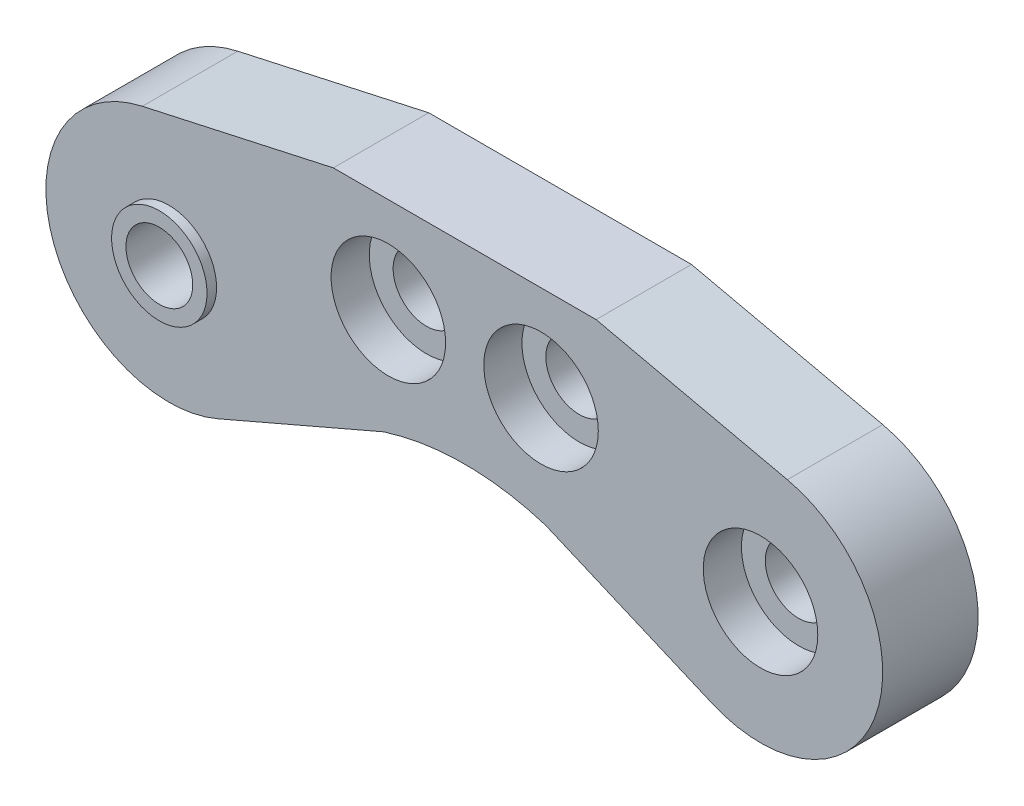
ISO-10303-21;
HEADER;
FILE_DESCRIPTION(('STEP AP214'),'2;1');
FILE_NAME('part.step','',(''),(''),'','','');
FILE_SCHEMA(('AUTOMOTIVE_DESIGN { 1 0 10303 214 1 1 1 1 }'));
ENDSEC;
DATA;
#1=APPLICATION_CONTEXT('core data for automotive mechanical design processes');
#2=APPLICATION_PROTOCOL_DEFINITION('international standard','automotive_design',2000,#1);
#3=PRODUCT_CONTEXT('',#1,'mechanical');
#4=PRODUCT('Part','Part','',(#3));
#5=PRODUCT_RELATED_PRODUCT_CATEGORY('part','',(#4));
#6=PRODUCT_DEFINITION_FORMATION('','',#4);
#7=PRODUCT_DEFINITION_CONTEXT('part definition',#1,'design');
#8=PRODUCT_DEFINITION('design','',#6,#7);
#9=PRODUCT_DEFINITION_SHAPE('','',#8);
#10=(LENGTH_UNIT() NAMED_UNIT(*) SI_UNIT(.MILLI.,.METRE.));
#11=(NAMED_UNIT(*) PLANE_ANGLE_UNIT() SI_UNIT($,.RADIAN.));
#12=(NAMED_UNIT(*) SI_UNIT($,.STERADIAN.) SOLID_ANGLE_UNIT());
#13=UNCERTAINTY_MEASURE_WITH_UNIT(LENGTH_MEASURE(1.E-05),#10,'distance_accuracy_value','');
#14=(GEOMETRIC_REPRESENTATION_CONTEXT(3) GLOBAL_UNCERTAINTY_ASSIGNED_CONTEXT((#13)) GLOBAL_UNIT_ASSIGNED_CONTEXT((#10,
#11,#12)) REPRESENTATION_CONTEXT('',''));
#15=CARTESIAN_POINT('',(0.,0.,0.));
#16=DIRECTION('',(0.,0.,1.));
#17=DIRECTION('',(1.,0.,0.));
#18=AXIS2_PLACEMENT_3D('',#15,#16,#17);
#19=CARTESIAN_POINT('',(45.5,-0.500000000000042,0.));
#20=DIRECTION('',(0.,0.,1.));
#21=DIRECTION('',(1.,0.,0.));
#22=AXIS2_PLACEMENT_3D('',#19,#20,#21);
#23=CYLINDRICAL_SURFACE('',#22,1.75);
#24=CARTESIAN_POINT('',(45.5,-0.500000000000042,0.));
#25=DIRECTION('',(0.,0.,1.));
#26=DIRECTION('',(1.,0.,0.));
#27=AXIS2_PLACEMENT_3D('',#24,#25,#26);
#28=CIRCLE('',#27,1.75);
#29=CARTESIAN_POINT('',(47.25,-0.500000000000042,0.));
#30=VERTEX_POINT('',#29);
#31=EDGE_CURVE('E187',#30,#30,#28,.T.);
#32=ORIENTED_EDGE('',*,*,#31,.F.);
#33=EDGE_LOOP('',(#32));
#34=FACE_BOUND('',#33,.T.);
#35=CARTESIAN_POINT('',(45.5,-0.500000000000042,3.));
#36=DIRECTION('',(0.,0.,1.));
#37=DIRECTION('',(1.,0.,0.));
#38=AXIS2_PLACEMENT_3D('',#35,#36,#37);
#39=CIRCLE('',#38,1.75);
#40=CARTESIAN_POINT('',(47.25,-0.500000000000042,3.));
#41=VERTEX_POINT('',#40);
#42=EDGE_CURVE('E36',#41,#41,#39,.F.);
#43=ORIENTED_EDGE('',*,*,#42,.F.);
#44=EDGE_LOOP('',(#43));
#45=FACE_BOUND('',#44,.T.);
#46=ADVANCED_FACE('F32',(#34,#45),#23,.F.);
#47=CARTESIAN_POINT('',(26.,3.00000000000002,0.));
#48=DIRECTION('',(0.,0.,1.));
#49=DIRECTION('',(1.,0.,0.));
#50=AXIS2_PLACEMENT_3D('',#47,#48,#49);
#51=CYLINDRICAL_SURFACE('',#50,1.75);
#52=CARTESIAN_POINT('',(26.,3.00000000000002,0.));
#53=DIRECTION('',(0.,0.,1.));
#54=DIRECTION('',(1.,0.,0.));
#55=AXIS2_PLACEMENT_3D('',#52,#53,#54);
#56=CIRCLE('',#55,1.75);
#57=CARTESIAN_POINT('',(27.75,3.00000000000002,0.));
#58=VERTEX_POINT('',#57);
#59=EDGE_CURVE('E190',#58,#58,#56,.T.);
#60=ORIENTED_EDGE('',*,*,#59,.F.);
#61=EDGE_LOOP('',(#60));
#62=FACE_BOUND('',#61,.T.);
#63=CARTESIAN_POINT('',(26.,3.00000000000002,3.));
#64=DIRECTION('',(0.,0.,1.));
#65=DIRECTION('',(1.,0.,0.));
#66=AXIS2_PLACEMENT_3D('',#63,#64,#65);
#67=CIRCLE('',#66,1.75);
#68=CARTESIAN_POINT('',(27.75,3.00000000000002,3.));
#69=VERTEX_POINT('',#68);
#70=EDGE_CURVE('E161',#69,#69,#67,.F.);
#71=ORIENTED_EDGE('',*,*,#70,.F.);
#72=EDGE_LOOP('',(#71));
#73=FACE_BOUND('',#72,.T.);
#74=ADVANCED_FACE('F229',(#62,#73),#51,.F.);
#75=CARTESIAN_POINT('',(34.,3.00000000000002,0.));
#76=DIRECTION('',(0.,0.,1.));
#77=DIRECTION('',(1.,0.,0.));
#78=AXIS2_PLACEMENT_3D('',#75,#76,#77);
#79=CYLINDRICAL_SURFACE('',#78,1.75);
#80=CARTESIAN_POINT('',(34.,3.00000000000002,0.));
#81=DIRECTION('',(0.,0.,1.));
#82=DIRECTION('',(1.,0.,0.));
#83=AXIS2_PLACEMENT_3D('',#80,#81,#82);
#84=CIRCLE('',#83,1.75);
#85=CARTESIAN_POINT('',(35.75,3.00000000000002,0.));
#86=VERTEX_POINT('',#85);
#87=EDGE_CURVE('E183',#86,#86,#84,.T.);
#88=ORIENTED_EDGE('',*,*,#87,.F.);
#89=EDGE_LOOP('',(#88));
#90=FACE_BOUND('',#89,.T.);
#91=CARTESIAN_POINT('',(34.,3.00000000000002,3.));
#92=DIRECTION('',(0.,0.,1.));
#93=DIRECTION('',(1.,0.,0.));
#94=AXIS2_PLACEMENT_3D('',#91,#92,#93);
#95=CIRCLE('',#94,1.75);
#96=CARTESIAN_POINT('',(35.75,3.00000000000002,3.));
#97=VERTEX_POINT('',#96);
#98=EDGE_CURVE('E159',#97,#97,#95,.F.);
#99=ORIENTED_EDGE('',*,*,#98,.F.);
#100=EDGE_LOOP('',(#99));
#101=FACE_BOUND('',#100,.T.);
#102=ADVANCED_FACE('F235',(#90,#101),#79,.F.);
#103=CARTESIAN_POINT('',(45.5,-0.500000000000042,5.));
#104=DIRECTION('',(0.,0.,1.));
#105=DIRECTION('',(1.,0.,0.));
#106=AXIS2_PLACEMENT_3D('',#103,#104,#105);
#107=PLANE('',#106);
#108=CARTESIAN_POINT('',(26.,3.00000000000002,5.));
#109=DIRECTION('',(0.,0.,1.));
#110=DIRECTION('',(1.,0.,0.));
#111=AXIS2_PLACEMENT_3D('',#108,#109,#110);
#112=CIRCLE('',#111,3.);
#113=CARTESIAN_POINT('',(29.,3.00000000000002,5.));
#114=VERTEX_POINT('',#113);
#115=EDGE_CURVE('E254',#114,#114,#112,.T.);
#116=ORIENTED_EDGE('',*,*,#115,.F.);
#117=EDGE_LOOP('',(#116));
#118=FACE_BOUND('',#117,.T.);
#119=CARTESIAN_POINT('',(34.,3.00000000000002,5.));
#120=DIRECTION('',(0.,0.,1.));
#121=DIRECTION('',(1.,0.,0.));
#122=AXIS2_PLACEMENT_3D('',#119,#120,#121);
#123=CIRCLE('',#122,3.);
#124=CARTESIAN_POINT('',(37.,3.00000000000002,5.));
#125=VERTEX_POINT('',#124);
#126=EDGE_CURVE('E258',#125,#125,#123,.T.);
#127=ORIENTED_EDGE('',*,*,#126,.F.);
#128=EDGE_LOOP('',(#127));
#129=FACE_BOUND('',#128,.T.);
#130=CARTESIAN_POINT('',(45.5,-0.500000000000042,5.));
#131=DIRECTION('',(0.,0.,1.));
#132=DIRECTION('',(1.,0.,0.));
#133=AXIS2_PLACEMENT_3D('',#130,#131,#132);
#134=CIRCLE('',#133,3.);
#135=CARTESIAN_POINT('',(48.5,-0.500000000000042,5.));
#136=VERTEX_POINT('',#135);
#137=EDGE_CURVE('E180',#136,#136,#134,.T.);
#138=ORIENTED_EDGE('',*,*,#137,.F.);
#139=EDGE_LOOP('',(#138));
#140=FACE_BOUND('',#139,.T.);
#141=DIRECTION('',(-0.97650782216454,-0.215481955744482,0.));
#142=VECTOR('',#141,1.);
#143=CARTESIAN_POINT('',(13.1115329469218,5.79216926059621,5.));
#144=LINE('',#143,#142);
#145=CARTESIAN_POINT('',(23.116843969807,8.,5.));
#146=VERTEX_POINT('',#145);
#147=CARTESIAN_POINT('',(13.1115329469218,5.79216926059621,5.));
#148=VERTEX_POINT('',#147);
#149=EDGE_CURVE('E147',#146,#148,#144,.T.);
#150=ORIENTED_EDGE('',*,*,#149,.T.);
#151=CARTESIAN_POINT('',(14.5,-0.49999999999998,5.));
#152=DIRECTION('',(0.,0.,1.));
#153=DIRECTION('',(1.,0.,0.));
#154=AXIS2_PLACEMENT_3D('',#151,#152,#153);
#155=CIRCLE('',#154,6.44354209743951);
#156=CARTESIAN_POINT('',(17.054090449502,-6.41572960312063,5.));
#157=VERTEX_POINT('',#156);
#158=EDGE_CURVE('E94',#148,#157,#155,.T.);
#159=ORIENTED_EDGE('',*,*,#158,.T.);
#160=DIRECTION('',(0.918086591763155,0.396379880953503,0.));
#161=VECTOR('',#160,1.);
#162=CARTESIAN_POINT('',(25.7555585383118,-2.65890871486508,5.));
#163=LINE('',#162,#161);
#164=CARTESIAN_POINT('',(25.7555585383118,-2.65890871486508,5.));
#165=VERTEX_POINT('',#164);
#166=EDGE_CURVE('E197',#157,#165,#163,.T.);
#167=ORIENTED_EDGE('',*,*,#166,.T.);
#168=CARTESIAN_POINT('',(30.,-15.9999999999997,5.));
#169=DIRECTION('',(0.,0.,-1.));
#170=DIRECTION('',(1.,0.,0.));
#171=AXIS2_PLACEMENT_3D('',#168,#169,#170);
#172=CIRCLE('',#171,13.9999999999998);
#173=CARTESIAN_POINT('',(34.2444414616882,-2.65890871486509,5.));
#174=VERTEX_POINT('',#173);
#175=EDGE_CURVE('E199',#165,#174,#172,.T.);
#176=ORIENTED_EDGE('',*,*,#175,.T.);
#177=DIRECTION('',(0.91985405001222,-0.392260789113719,0.));
#178=VECTOR('',#177,1.);
#179=CARTESIAN_POINT('',(34.2444414616882,-2.65890871486509,5.));
#180=LINE('',#179,#178);
#181=CARTESIAN_POINT('',(42.9891405720765,-6.38798135802775,5.));
#182=VERTEX_POINT('',#181);
#183=EDGE_CURVE('E114',#174,#182,#180,.T.);
#184=ORIENTED_EDGE('',*,*,#183,.T.);
#185=CARTESIAN_POINT('',(45.5,-0.500000000000042,5.));
#186=DIRECTION('',(0.,0.,1.));
#187=DIRECTION('',(1.,0.,0.));
#188=AXIS2_PLACEMENT_3D('',#185,#186,#187);
#189=CIRCLE('',#188,6.40099519912913);
#190=CARTESIAN_POINT('',(46.9052092102304,5.744848005737,5.));
#191=VERTEX_POINT('',#190);
#192=EDGE_CURVE('E107',#182,#191,#189,.T.);
#193=ORIENTED_EDGE('',*,*,#192,.T.);
#194=DIRECTION('',(-0.975605794328148,0.21952980224412,0.));
#195=VECTOR('',#194,1.);
#196=CARTESIAN_POINT('',(46.9052092102304,5.744848005737,5.));
#197=LINE('',#196,#195);
#198=CARTESIAN_POINT('',(36.883156030193,8.,5.));
#199=VERTEX_POINT('',#198);
#200=EDGE_CURVE('E112',#191,#199,#197,.T.);
#201=ORIENTED_EDGE('',*,*,#200,.T.);
#202=DIRECTION('',(-1.,0.,0.));
#203=VECTOR('',#202,1.);
#204=CARTESIAN_POINT('',(23.116843969807,8.,5.));
#205=LINE('',#204,#203);
#206=EDGE_CURVE('E51',#199,#146,#205,.T.);
#207=ORIENTED_EDGE('',*,*,#206,.T.);
#208=EDGE_LOOP('',(#150,#159,#167,#176,#184,#193,#201,#207));
#209=FACE_BOUND('',#208,.T.);
#210=CARTESIAN_POINT('',(14.5,-0.49999999999998,5.));
#211=DIRECTION('',(0.,0.,1.));
#212=DIRECTION('',(1.,0.,0.));
#213=AXIS2_PLACEMENT_3D('',#210,#211,#212);
#214=CIRCLE('',#213,2.5);
#215=CARTESIAN_POINT('',(17.,-0.49999999999998,5.));
#216=VERTEX_POINT('',#215);
#217=EDGE_CURVE('E171',#216,#216,#214,.T.);
#218=ORIENTED_EDGE('',*,*,#217,.F.);
#219=EDGE_LOOP('',(#218));
#220=FACE_BOUND('',#219,.T.);
#221=ADVANCED_FACE('F109',(#118,#129,#140,#209,#220),#107,.T.);
#222=CARTESIAN_POINT('',(13.1115329469218,5.79216926059621,5.));
#223=DIRECTION('',(0.215481955744482,-0.97650782216454,0.));
#224=DIRECTION('',(0.97650782216454,0.215481955744482,0.));
#225=AXIS2_PLACEMENT_3D('',#222,#223,#224);
#226=PLANE('',#225);
#227=DIRECTION('',(-0.97650782216454,-0.215481955744482,0.));
#228=VECTOR('',#227,1.);
#229=CARTESIAN_POINT('',(13.1115329469218,5.79216926059621,0.));
#230=LINE('',#229,#228);
#231=CARTESIAN_POINT('',(23.116843969807,8.,0.));
#232=VERTEX_POINT('',#231);
#233=CARTESIAN_POINT('',(13.1115329469218,5.79216926059621,0.));
#234=VERTEX_POINT('',#233);
#235=EDGE_CURVE('E132',#232,#234,#230,.T.);
#236=ORIENTED_EDGE('',*,*,#235,.T.);
#237=DIRECTION('',(0.,0.,-1.));
#238=VECTOR('',#237,1.);
#239=CARTESIAN_POINT('',(13.1115329469218,5.79216926059621,5.));
#240=LINE('',#239,#238);
#241=EDGE_CURVE('E11',#148,#234,#240,.T.);
#242=ORIENTED_EDGE('',*,*,#241,.F.);
#243=ORIENTED_EDGE('',*,*,#149,.F.);
#244=DIRECTION('',(0.,0.,-1.));
#245=VECTOR('',#244,1.);
#246=CARTESIAN_POINT('',(23.116843969807,8.,5.));
#247=LINE('',#246,#245);
#248=EDGE_CURVE('E128',#146,#232,#247,.T.);
#249=ORIENTED_EDGE('',*,*,#248,.T.);
#250=EDGE_LOOP('',(#236,#242,#243,#249));
#251=FACE_BOUND('',#250,.T.);
#252=ADVANCED_FACE('F34',(#251),#226,.F.);
#253=CARTESIAN_POINT('',(14.5,-0.49999999999998,5.));
#254=DIRECTION('',(0.,0.,-1.));
#255=DIRECTION('',(-1.,0.,0.));
#256=AXIS2_PLACEMENT_3D('',#253,#254,#255);
#257=CYLINDRICAL_SURFACE('',#256,6.44354209743951);
#258=CARTESIAN_POINT('',(14.5,-0.49999999999998,0.));
#259=DIRECTION('',(0.,0.,1.));
#260=DIRECTION('',(1.,0.,0.));
#261=AXIS2_PLACEMENT_3D('',#258,#259,#260);
#262=CIRCLE('',#261,6.44354209743951);
#263=CARTESIAN_POINT('',(17.054090449502,-6.41572960312063,0.));
#264=VERTEX_POINT('',#263);
#265=EDGE_CURVE('E135',#234,#264,#262,.T.);
#266=ORIENTED_EDGE('',*,*,#265,.T.);
#267=DIRECTION('',(0.,0.,-1.));
#268=VECTOR('',#267,1.);
#269=CARTESIAN_POINT('',(17.054090449502,-6.41572960312063,5.));
#270=LINE('',#269,#268);
#271=EDGE_CURVE('E42',#157,#264,#270,.T.);
#272=ORIENTED_EDGE('',*,*,#271,.F.);
#273=ORIENTED_EDGE('',*,*,#158,.F.);
#274=ORIENTED_EDGE('',*,*,#241,.T.);
#275=EDGE_LOOP('',(#266,#272,#273,#274));
#276=FACE_BOUND('',#275,.T.);
#277=ADVANCED_FACE('F249',(#276),#257,.T.);
#278=CARTESIAN_POINT('',(25.7555585383118,-2.65890871486508,5.));
#279=DIRECTION('',(-0.396379880953503,0.918086591763155,0.));
#280=DIRECTION('',(-0.918086591763155,-0.396379880953503,0.));
#281=AXIS2_PLACEMENT_3D('',#278,#279,#280);
#282=PLANE('',#281);
#283=DIRECTION('',(0.918086591763155,0.396379880953503,0.));
#284=VECTOR('',#283,1.);
#285=CARTESIAN_POINT('',(25.7555585383118,-2.65890871486508,0.));
#286=LINE('',#285,#284);
#287=CARTESIAN_POINT('',(25.7555585383118,-2.65890871486508,0.));
#288=VERTEX_POINT('',#287);
#289=EDGE_CURVE('E138',#264,#288,#286,.T.);
#290=ORIENTED_EDGE('',*,*,#289,.T.);
#291=DIRECTION('',(0.,0.,-1.));
#292=VECTOR('',#291,1.);
#293=CARTESIAN_POINT('',(25.7555585383118,-2.65890871486508,5.));
#294=LINE('',#293,#292);
#295=EDGE_CURVE('E154',#165,#288,#294,.T.);
#296=ORIENTED_EDGE('',*,*,#295,.F.);
#297=ORIENTED_EDGE('',*,*,#166,.F.);
#298=ORIENTED_EDGE('',*,*,#271,.T.);
#299=EDGE_LOOP('',(#290,#296,#297,#298));
#300=FACE_BOUND('',#299,.T.);
#301=ADVANCED_FACE('F428',(#300),#282,.F.);
#302=CARTESIAN_POINT('',(30.,-15.9999999999997,5.));
#303=DIRECTION('',(0.,0.,-1.));
#304=DIRECTION('',(-1.,0.,0.));
#305=AXIS2_PLACEMENT_3D('',#302,#303,#304);
#306=CYLINDRICAL_SURFACE('',#305,13.9999999999998);
#307=CARTESIAN_POINT('',(30.,-15.9999999999997,0.));
#308=DIRECTION('',(0.,0.,-1.));
#309=DIRECTION('',(1.,0.,0.));
#310=AXIS2_PLACEMENT_3D('',#307,#308,#309);
#311=CIRCLE('',#310,13.9999999999998);
#312=CARTESIAN_POINT('',(34.2444414616882,-2.65890871486509,0.));
#313=VERTEX_POINT('',#312);
#314=EDGE_CURVE('E140',#288,#313,#311,.T.);
#315=ORIENTED_EDGE('',*,*,#314,.T.);
#316=DIRECTION('',(0.,0.,-1.));
#317=VECTOR('',#316,1.);
#318=CARTESIAN_POINT('',(34.2444414616882,-2.65890871486509,5.));
#319=LINE('',#318,#317);
#320=EDGE_CURVE('E151',#174,#313,#319,.T.);
#321=ORIENTED_EDGE('',*,*,#320,.F.);
#322=ORIENTED_EDGE('',*,*,#175,.F.);
#323=ORIENTED_EDGE('',*,*,#295,.T.);
#324=EDGE_LOOP('',(#315,#321,#322,#323));
#325=FACE_BOUND('',#324,.T.);
#326=ADVANCED_FACE('F205',(#325),#306,.F.);
#327=CARTESIAN_POINT('',(34.2444414616882,-2.65890871486509,5.));
#328=DIRECTION('',(0.392260789113719,0.91985405001222,0.));
#329=DIRECTION('',(-0.91985405001222,0.392260789113719,0.));
#330=AXIS2_PLACEMENT_3D('',#327,#328,#329);
#331=PLANE('',#330);
#332=DIRECTION('',(0.91985405001222,-0.392260789113719,0.));
#333=VECTOR('',#332,1.);
#334=CARTESIAN_POINT('',(34.2444414616882,-2.65890871486509,0.));
#335=LINE('',#334,#333);
#336=CARTESIAN_POINT('',(42.9891405720765,-6.38798135802775,0.));
#337=VERTEX_POINT('',#336);
#338=EDGE_CURVE('E142',#313,#337,#335,.T.);
#339=ORIENTED_EDGE('',*,*,#338,.T.);
#340=DIRECTION('',(0.,0.,-1.));
#341=VECTOR('',#340,1.);
#342=CARTESIAN_POINT('',(42.9891405720765,-6.38798135802775,5.));
#343=LINE('',#342,#341);
#344=EDGE_CURVE('E123',#182,#337,#343,.T.);
#345=ORIENTED_EDGE('',*,*,#344,.F.);
#346=ORIENTED_EDGE('',*,*,#183,.F.);
#347=ORIENTED_EDGE('',*,*,#320,.T.);
#348=EDGE_LOOP('',(#339,#345,#346,#347));
#349=FACE_BOUND('',#348,.T.);
#350=ADVANCED_FACE('F209',(#349),#331,.F.);
#351=CARTESIAN_POINT('',(45.5,-0.500000000000042,5.));
#352=DIRECTION('',(0.,0.,-1.));
#353=DIRECTION('',(-1.,0.,0.));
#354=AXIS2_PLACEMENT_3D('',#351,#352,#353);
#355=CYLINDRICAL_SURFACE('',#354,6.40099519912913);
#356=CARTESIAN_POINT('',(45.5,-0.500000000000042,0.));
#357=DIRECTION('',(0.,0.,1.));
#358=DIRECTION('',(1.,0.,0.));
#359=AXIS2_PLACEMENT_3D('',#356,#357,#358);
#360=CIRCLE('',#359,6.40099519912913);
#361=CARTESIAN_POINT('',(46.9052092102304,5.744848005737,0.));
#362=VERTEX_POINT('',#361);
#363=EDGE_CURVE('E122',#337,#362,#360,.T.);
#364=ORIENTED_EDGE('',*,*,#363,.T.);
#365=DIRECTION('',(0.,0.,-1.));
#366=VECTOR('',#365,1.);
#367=CARTESIAN_POINT('',(46.9052092102304,5.744848005737,5.));
#368=LINE('',#367,#366);
#369=EDGE_CURVE('E119',#191,#362,#368,.T.);
#370=ORIENTED_EDGE('',*,*,#369,.F.);
#371=ORIENTED_EDGE('',*,*,#192,.F.);
#372=ORIENTED_EDGE('',*,*,#344,.T.);
#373=EDGE_LOOP('',(#364,#370,#371,#372));
#374=FACE_BOUND('',#373,.T.);
#375=ADVANCED_FACE('F120',(#374),#355,.T.);
#376=CARTESIAN_POINT('',(46.9052092102304,5.744848005737,5.));
#377=DIRECTION('',(-0.21952980224412,-0.975605794328149,0.));
#378=DIRECTION('',(0.975605794328149,-0.21952980224412,0.));
#379=AXIS2_PLACEMENT_3D('',#376,#377,#378);
#380=PLANE('',#379);
#381=DIRECTION('',(-0.975605794328148,0.21952980224412,0.));
#382=VECTOR('',#381,1.);
#383=CARTESIAN_POINT('',(46.9052092102304,5.744848005737,0.));
#384=LINE('',#383,#382);
#385=CARTESIAN_POINT('',(36.883156030193,8.,0.));
#386=VERTEX_POINT('',#385);
#387=EDGE_CURVE('E80',#362,#386,#384,.T.);
#388=ORIENTED_EDGE('',*,*,#387,.T.);
#389=DIRECTION('',(0.,0.,-1.));
#390=VECTOR('',#389,1.);
#391=CARTESIAN_POINT('',(36.883156030193,8.,5.));
#392=LINE('',#391,#390);
#393=EDGE_CURVE('E124',#199,#386,#392,.T.);
#394=ORIENTED_EDGE('',*,*,#393,.F.);
#395=ORIENTED_EDGE('',*,*,#200,.F.);
#396=ORIENTED_EDGE('',*,*,#369,.T.);
#397=EDGE_LOOP('',(#388,#394,#395,#396));
#398=FACE_BOUND('',#397,.T.);
#399=ADVANCED_FACE('F126',(#398),#380,.F.);
#400=CARTESIAN_POINT('',(23.116843969807,8.,5.));
#401=DIRECTION('',(0.,-1.,0.));
#402=DIRECTION('',(1.,0.,0.));
#403=AXIS2_PLACEMENT_3D('',#400,#401,#402);
#404=PLANE('',#403);
#405=DIRECTION('',(-1.,0.,0.));
#406=VECTOR('',#405,1.);
#407=CARTESIAN_POINT('',(23.116843969807,8.,0.));
#408=LINE('',#407,#406);
#409=EDGE_CURVE('E86',#386,#232,#408,.T.);
#410=ORIENTED_EDGE('',*,*,#409,.T.);
#411=ORIENTED_EDGE('',*,*,#248,.F.);
#412=ORIENTED_EDGE('',*,*,#206,.F.);
#413=ORIENTED_EDGE('',*,*,#393,.T.);
#414=EDGE_LOOP('',(#410,#411,#412,#413));
#415=FACE_BOUND('',#414,.T.);
#416=ADVANCED_FACE('F217',(#415),#404,.F.);
#417=CARTESIAN_POINT('',(45.5,-0.500000000000042,0.));
#418=DIRECTION('',(0.,0.,1.));
#419=DIRECTION('',(1.,0.,0.));
#420=AXIS2_PLACEMENT_3D('',#417,#418,#419);
#421=PLANE('',#420);
#422=CARTESIAN_POINT('',(14.5,-0.49999999999998,0.));
#423=DIRECTION('',(0.,0.,1.));
#424=DIRECTION('',(1.,0.,0.));
#425=AXIS2_PLACEMENT_3D('',#422,#423,#424);
#426=CIRCLE('',#425,1.75);
#427=CARTESIAN_POINT('',(16.25,-0.49999999999998,0.));
#428=VERTEX_POINT('',#427);
#429=EDGE_CURVE('E136',#428,#428,#426,.T.);
#430=ORIENTED_EDGE('',*,*,#429,.T.);
#431=EDGE_LOOP('',(#430));
#432=FACE_BOUND('',#431,.T.);
#433=ORIENTED_EDGE('',*,*,#87,.T.);
#434=EDGE_LOOP('',(#433));
#435=FACE_BOUND('',#434,.T.);
#436=ORIENTED_EDGE('',*,*,#59,.T.);
#437=EDGE_LOOP('',(#436));
#438=FACE_BOUND('',#437,.T.);
#439=ORIENTED_EDGE('',*,*,#31,.T.);
#440=EDGE_LOOP('',(#439));
#441=FACE_BOUND('',#440,.T.);
#442=ORIENTED_EDGE('',*,*,#235,.F.);
#443=ORIENTED_EDGE('',*,*,#409,.F.);
#444=ORIENTED_EDGE('',*,*,#387,.F.);
#445=ORIENTED_EDGE('',*,*,#363,.F.);
#446=ORIENTED_EDGE('',*,*,#338,.F.);
#447=ORIENTED_EDGE('',*,*,#314,.F.);
#448=ORIENTED_EDGE('',*,*,#289,.F.);
#449=ORIENTED_EDGE('',*,*,#265,.F.);
#450=EDGE_LOOP('',(#442,#443,#444,#445,#446,#447,#448,#449));
#451=FACE_BOUND('',#450,.T.);
#452=ADVANCED_FACE('F212',(#432,#435,#438,#441,#451),#421,.F.);
#453=CARTESIAN_POINT('',(14.5,-0.49999999999998,0.));
#454=DIRECTION('',(0.,0.,1.));
#455=DIRECTION('',(1.,0.,0.));
#456=AXIS2_PLACEMENT_3D('',#453,#454,#455);
#457=CYLINDRICAL_SURFACE('',#456,1.75);
#458=ORIENTED_EDGE('',*,*,#429,.F.);
#459=EDGE_LOOP('',(#458));
#460=FACE_BOUND('',#459,.T.);
#461=CARTESIAN_POINT('',(14.5,-0.49999999999998,5.5));
#462=DIRECTION('',(0.,0.,1.));
#463=DIRECTION('',(1.,0.,0.));
#464=AXIS2_PLACEMENT_3D('',#461,#462,#463);
#465=CIRCLE('',#464,1.75);
#466=CARTESIAN_POINT('',(16.25,-0.49999999999998,5.5));
#467=VERTEX_POINT('',#466);
#468=EDGE_CURVE('E167',#467,#467,#465,.T.);
#469=ORIENTED_EDGE('',*,*,#468,.T.);
#470=EDGE_LOOP('',(#469));
#471=FACE_BOUND('',#470,.T.);
#472=ADVANCED_FACE('F224',(#460,#471),#457,.F.);
#473=CARTESIAN_POINT('',(14.5,-0.49999999999998,5.5));
#474=DIRECTION('',(0.,0.,1.));
#475=DIRECTION('',(1.,0.,0.));
#476=AXIS2_PLACEMENT_3D('',#473,#474,#475);
#477=PLANE('',#476);
#478=CARTESIAN_POINT('',(14.5,-0.49999999999998,5.5));
#479=DIRECTION('',(0.,0.,1.));
#480=DIRECTION('',(1.,0.,0.));
#481=AXIS2_PLACEMENT_3D('',#478,#479,#480);
#482=CIRCLE('',#481,2.5);
#483=CARTESIAN_POINT('',(17.,-0.49999999999998,5.5));
#484=VERTEX_POINT('',#483);
#485=EDGE_CURVE('E176',#484,#484,#482,.T.);
#486=ORIENTED_EDGE('',*,*,#485,.T.);
#487=EDGE_LOOP('',(#486));
#488=FACE_BOUND('',#487,.T.);
#489=ORIENTED_EDGE('',*,*,#468,.F.);
#490=EDGE_LOOP('',(#489));
#491=FACE_BOUND('',#490,.T.);
#492=ADVANCED_FACE('F302',(#488,#491),#477,.T.);
#493=CARTESIAN_POINT('',(14.5,-0.49999999999998,5.5));
#494=DIRECTION('',(0.,0.,-1.));
#495=DIRECTION('',(-1.,0.,0.));
#496=AXIS2_PLACEMENT_3D('',#493,#494,#495);
#497=CYLINDRICAL_SURFACE('',#496,2.5);
#498=ORIENTED_EDGE('',*,*,#485,.F.);
#499=EDGE_LOOP('',(#498));
#500=FACE_BOUND('',#499,.T.);
#501=ORIENTED_EDGE('',*,*,#217,.T.);
#502=EDGE_LOOP('',(#501));
#503=FACE_BOUND('',#502,.T.);
#504=ADVANCED_FACE('F294',(#500,#503),#497,.T.);
#505=CARTESIAN_POINT('',(34.,3.00000000000002,3.));
#506=DIRECTION('',(0.,0.,1.));
#507=DIRECTION('',(1.,0.,0.));
#508=AXIS2_PLACEMENT_3D('',#505,#506,#507);
#509=PLANE('',#508);
#510=CARTESIAN_POINT('',(34.,3.00000000000002,3.));
#511=DIRECTION('',(0.,0.,1.));
#512=DIRECTION('',(1.,0.,0.));
#513=AXIS2_PLACEMENT_3D('',#510,#511,#512);
#514=CIRCLE('',#513,3.);
#515=CARTESIAN_POINT('',(37.,3.00000000000002,3.));
#516=VERTEX_POINT('',#515);
#517=EDGE_CURVE('E266',#516,#516,#514,.T.);
#518=ORIENTED_EDGE('',*,*,#517,.T.);
#519=EDGE_LOOP('',(#518));
#520=FACE_BOUND('',#519,.T.);
#521=ORIENTED_EDGE('',*,*,#98,.T.);
#522=EDGE_LOOP('',(#521));
#523=FACE_BOUND('',#522,.T.);
#524=ADVANCED_FACE('F291',(#520,#523),#509,.T.);
#525=CARTESIAN_POINT('',(34.,3.00000000000002,3.));
#526=DIRECTION('',(0.,0.,1.));
#527=DIRECTION('',(1.,0.,0.));
#528=AXIS2_PLACEMENT_3D('',#525,#526,#527);
#529=CYLINDRICAL_SURFACE('',#528,3.);
#530=ORIENTED_EDGE('',*,*,#517,.F.);
#531=EDGE_LOOP('',(#530));
#532=FACE_BOUND('',#531,.T.);
#533=ORIENTED_EDGE('',*,*,#126,.T.);
#534=EDGE_LOOP('',(#533));
#535=FACE_BOUND('',#534,.T.);
#536=ADVANCED_FACE('F288',(#532,#535),#529,.F.);
#537=CARTESIAN_POINT('',(26.,3.00000000000002,3.));
#538=DIRECTION('',(0.,0.,1.));
#539=DIRECTION('',(1.,0.,0.));
#540=AXIS2_PLACEMENT_3D('',#537,#538,#539);
#541=PLANE('',#540);
#542=CARTESIAN_POINT('',(26.,3.00000000000002,3.));
#543=DIRECTION('',(0.,0.,1.));
#544=DIRECTION('',(1.,0.,0.));
#545=AXIS2_PLACEMENT_3D('',#542,#543,#544);
#546=CIRCLE('',#545,3.);
#547=CARTESIAN_POINT('',(29.,3.00000000000002,3.));
#548=VERTEX_POINT('',#547);
#549=EDGE_CURVE('E162',#548,#548,#546,.T.);
#550=ORIENTED_EDGE('',*,*,#549,.T.);
#551=EDGE_LOOP('',(#550));
#552=FACE_BOUND('',#551,.T.);
#553=ORIENTED_EDGE('',*,*,#70,.T.);
#554=EDGE_LOOP('',(#553));
#555=FACE_BOUND('',#554,.T.);
#556=ADVANCED_FACE('F275',(#552,#555),#541,.T.);
#557=CARTESIAN_POINT('',(26.,3.00000000000002,3.));
#558=DIRECTION('',(0.,0.,1.));
#559=DIRECTION('',(1.,0.,0.));
#560=AXIS2_PLACEMENT_3D('',#557,#558,#559);
#561=CYLINDRICAL_SURFACE('',#560,3.);
#562=ORIENTED_EDGE('',*,*,#549,.F.);
#563=EDGE_LOOP('',(#562));
#564=FACE_BOUND('',#563,.T.);
#565=ORIENTED_EDGE('',*,*,#115,.T.);
#566=EDGE_LOOP('',(#565));
#567=FACE_BOUND('',#566,.T.);
#568=ADVANCED_FACE('F277',(#564,#567),#561,.F.);
#569=CARTESIAN_POINT('',(45.5,-0.500000000000042,3.));
#570=DIRECTION('',(0.,0.,1.));
#571=DIRECTION('',(1.,0.,0.));
#572=AXIS2_PLACEMENT_3D('',#569,#570,#571);
#573=PLANE('',#572);
#574=CARTESIAN_POINT('',(45.5,-0.500000000000042,3.));
#575=DIRECTION('',(0.,0.,1.));
#576=DIRECTION('',(1.,0.,0.));
#577=AXIS2_PLACEMENT_3D('',#574,#575,#576);
#578=CIRCLE('',#577,3.);
#579=CARTESIAN_POINT('',(48.5,-0.500000000000042,3.));
#580=VERTEX_POINT('',#579);
#581=EDGE_CURVE('E262',#580,#580,#578,.T.);
#582=ORIENTED_EDGE('',*,*,#581,.T.);
#583=EDGE_LOOP('',(#582));
#584=FACE_BOUND('',#583,.T.);
#585=ORIENTED_EDGE('',*,*,#42,.T.);
#586=EDGE_LOOP('',(#585));
#587=FACE_BOUND('',#586,.T.);
#588=ADVANCED_FACE('F280',(#584,#587),#573,.T.);
#589=CARTESIAN_POINT('',(45.5,-0.500000000000042,3.));
#590=DIRECTION('',(0.,0.,1.));
#591=DIRECTION('',(1.,0.,0.));
#592=AXIS2_PLACEMENT_3D('',#589,#590,#591);
#593=CYLINDRICAL_SURFACE('',#592,3.);
#594=ORIENTED_EDGE('',*,*,#581,.F.);
#595=EDGE_LOOP('',(#594));
#596=FACE_BOUND('',#595,.T.);
#597=ORIENTED_EDGE('',*,*,#137,.T.);
#598=EDGE_LOOP('',(#597));
#599=FACE_BOUND('',#598,.T.);
#600=ADVANCED_FACE('F286',(#596,#599),#593,.F.);
#601=CLOSED_SHELL('',(#46,#74,#102,#221,#252,#277,#301,#326,#350,#375,#399,#416,#452,#472,#492,
#504,#524,#536,#556,#568,#588,#600));
#602=MANIFOLD_SOLID_BREP('B2',#601);
#603=ADVANCED_BREP_SHAPE_REPRESENTATION('',(#18,#602),#14);
#604=SHAPE_DEFINITION_REPRESENTATION(#9,#603);
ENDSEC;
END-ISO-10303-21;
